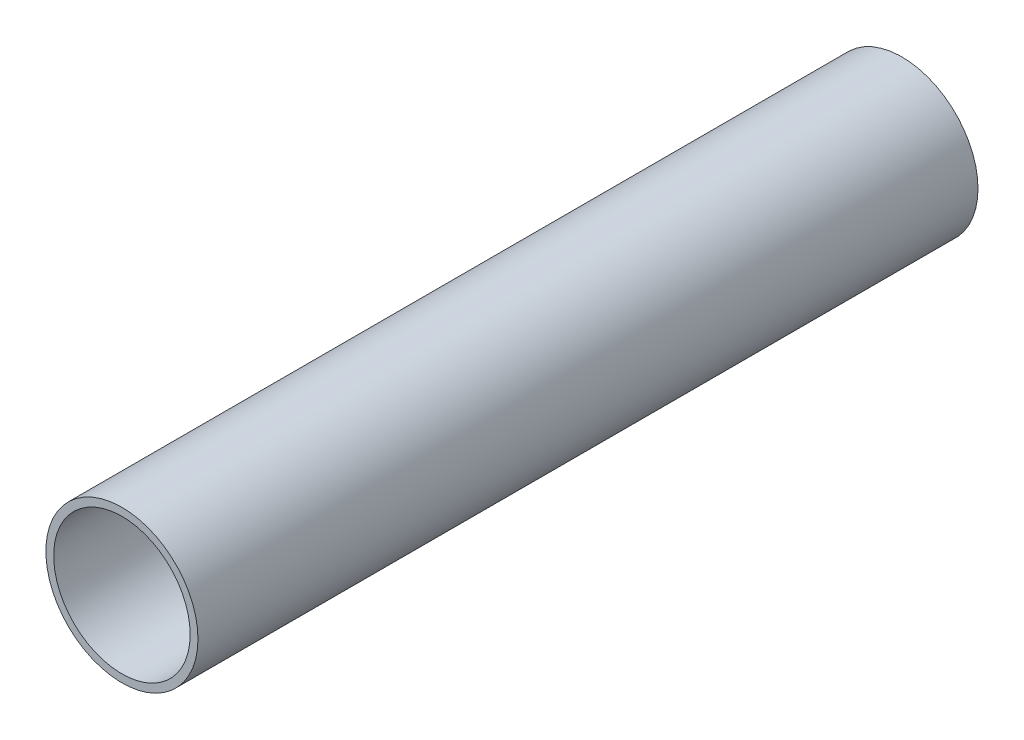
ISO-10303-21;
HEADER;
FILE_DESCRIPTION(('STEP AP214'),'2;1');
FILE_NAME('part.step','',(''),(''),'','','');
FILE_SCHEMA(('AUTOMOTIVE_DESIGN { 1 0 10303 214 1 1 1 1 }'));
ENDSEC;
DATA;
#1=APPLICATION_CONTEXT('core data for automotive mechanical design processes');
#2=APPLICATION_PROTOCOL_DEFINITION('international standard','automotive_design',2000,#1);
#3=PRODUCT_CONTEXT('',#1,'mechanical');
#4=PRODUCT('Part','Part','',(#3));
#5=PRODUCT_RELATED_PRODUCT_CATEGORY('part','',(#4));
#6=PRODUCT_DEFINITION_FORMATION('','',#4);
#7=PRODUCT_DEFINITION_CONTEXT('part definition',#1,'design');
#8=PRODUCT_DEFINITION('design','',#6,#7);
#9=PRODUCT_DEFINITION_SHAPE('','',#8);
#10=(LENGTH_UNIT() NAMED_UNIT(*) SI_UNIT(.MILLI.,.METRE.));
#11=(NAMED_UNIT(*) PLANE_ANGLE_UNIT() SI_UNIT($,.RADIAN.));
#12=(NAMED_UNIT(*) SI_UNIT($,.STERADIAN.) SOLID_ANGLE_UNIT());
#13=UNCERTAINTY_MEASURE_WITH_UNIT(LENGTH_MEASURE(1.E-05),#10,'distance_accuracy_value','');
#14=(GEOMETRIC_REPRESENTATION_CONTEXT(3) GLOBAL_UNCERTAINTY_ASSIGNED_CONTEXT((#13)) GLOBAL_UNIT_ASSIGNED_CONTEXT((#10,
#11,#12)) REPRESENTATION_CONTEXT('',''));
#15=CARTESIAN_POINT('',(0.,0.,0.));
#16=DIRECTION('',(0.,0.,1.));
#17=DIRECTION('',(1.,0.,0.));
#18=AXIS2_PLACEMENT_3D('',#15,#16,#17);
#19=CARTESIAN_POINT('',(0.,0.,20.));
#20=DIRECTION('',(0.,0.,1.));
#21=DIRECTION('',(1.,0.,0.));
#22=AXIS2_PLACEMENT_3D('',#19,#20,#21);
#23=PLANE('',#22);
#24=CARTESIAN_POINT('',(0.,0.,20.));
#25=DIRECTION('',(0.,0.,1.));
#26=DIRECTION('',(1.,0.,0.));
#27=AXIS2_PLACEMENT_3D('',#24,#25,#26);
#28=CIRCLE('',#27,1.95);
#29=CARTESIAN_POINT('',(1.95,0.,20.));
#30=VERTEX_POINT('',#29);
#31=EDGE_CURVE('E10',#30,#30,#28,.T.);
#32=ORIENTED_EDGE('',*,*,#31,.T.);
#33=EDGE_LOOP('',(#32));
#34=FACE_BOUND('',#33,.T.);
#35=CARTESIAN_POINT('',(0.,0.,20.));
#36=DIRECTION('',(0.,0.,1.));
#37=DIRECTION('',(1.,0.,0.));
#38=AXIS2_PLACEMENT_3D('',#35,#36,#37);
#39=CIRCLE('',#38,1.75);
#40=CARTESIAN_POINT('',(1.75,0.,20.));
#41=VERTEX_POINT('',#40);
#42=EDGE_CURVE('E45',#41,#41,#39,.T.);
#43=ORIENTED_EDGE('',*,*,#42,.F.);
#44=EDGE_LOOP('',(#43));
#45=FACE_BOUND('',#44,.T.);
#46=ADVANCED_FACE('F34',(#34,#45),#23,.T.);
#47=CARTESIAN_POINT('',(0.,0.,0.));
#48=DIRECTION('',(0.,0.,1.));
#49=DIRECTION('',(1.,0.,0.));
#50=AXIS2_PLACEMENT_3D('',#47,#48,#49);
#51=PLANE('',#50);
#52=CARTESIAN_POINT('',(0.,0.,0.));
#53=DIRECTION('',(0.,0.,1.));
#54=DIRECTION('',(1.,0.,0.));
#55=AXIS2_PLACEMENT_3D('',#52,#53,#54);
#56=CIRCLE('',#55,1.95);
#57=CARTESIAN_POINT('',(1.95,0.,0.));
#58=VERTEX_POINT('',#57);
#59=EDGE_CURVE('E38',#58,#58,#56,.T.);
#60=ORIENTED_EDGE('',*,*,#59,.F.);
#61=EDGE_LOOP('',(#60));
#62=FACE_BOUND('',#61,.T.);
#63=CARTESIAN_POINT('',(0.,0.,0.));
#64=DIRECTION('',(0.,0.,1.));
#65=DIRECTION('',(1.,0.,0.));
#66=AXIS2_PLACEMENT_3D('',#63,#64,#65);
#67=CIRCLE('',#66,1.75);
#68=CARTESIAN_POINT('',(1.75,0.,0.));
#69=VERTEX_POINT('',#68);
#70=EDGE_CURVE('E47',#69,#69,#67,.T.);
#71=ORIENTED_EDGE('',*,*,#70,.T.);
#72=EDGE_LOOP('',(#71));
#73=FACE_BOUND('',#72,.T.);
#74=ADVANCED_FACE('F57',(#62,#73),#51,.F.);
#75=CARTESIAN_POINT('',(0.,0.,20.));
#76=DIRECTION('',(0.,0.,-1.));
#77=DIRECTION('',(-1.,0.,0.));
#78=AXIS2_PLACEMENT_3D('',#75,#76,#77);
#79=CYLINDRICAL_SURFACE('',#78,1.95);
#80=ORIENTED_EDGE('',*,*,#31,.F.);
#81=EDGE_LOOP('',(#80));
#82=FACE_BOUND('',#81,.T.);
#83=ORIENTED_EDGE('',*,*,#59,.T.);
#84=EDGE_LOOP('',(#83));
#85=FACE_BOUND('',#84,.T.);
#86=ADVANCED_FACE('F36',(#82,#85),#79,.T.);
#87=CARTESIAN_POINT('',(0.,0.,20.));
#88=DIRECTION('',(0.,0.,-1.));
#89=DIRECTION('',(-1.,0.,0.));
#90=AXIS2_PLACEMENT_3D('',#87,#88,#89);
#91=CYLINDRICAL_SURFACE('',#90,1.75);
#92=ORIENTED_EDGE('',*,*,#42,.T.);
#93=EDGE_LOOP('',(#92));
#94=FACE_BOUND('',#93,.T.);
#95=ORIENTED_EDGE('',*,*,#70,.F.);
#96=EDGE_LOOP('',(#95));
#97=FACE_BOUND('',#96,.T.);
#98=ADVANCED_FACE('F53',(#94,#97),#91,.F.);
#99=CLOSED_SHELL('',(#46,#74,#86,#98));
#100=MANIFOLD_SOLID_BREP('B2',#99);
#101=ADVANCED_BREP_SHAPE_REPRESENTATION('',(#18,#100),#14);
#102=SHAPE_DEFINITION_REPRESENTATION(#9,#101);
ENDSEC;
END-ISO-10303-21;
